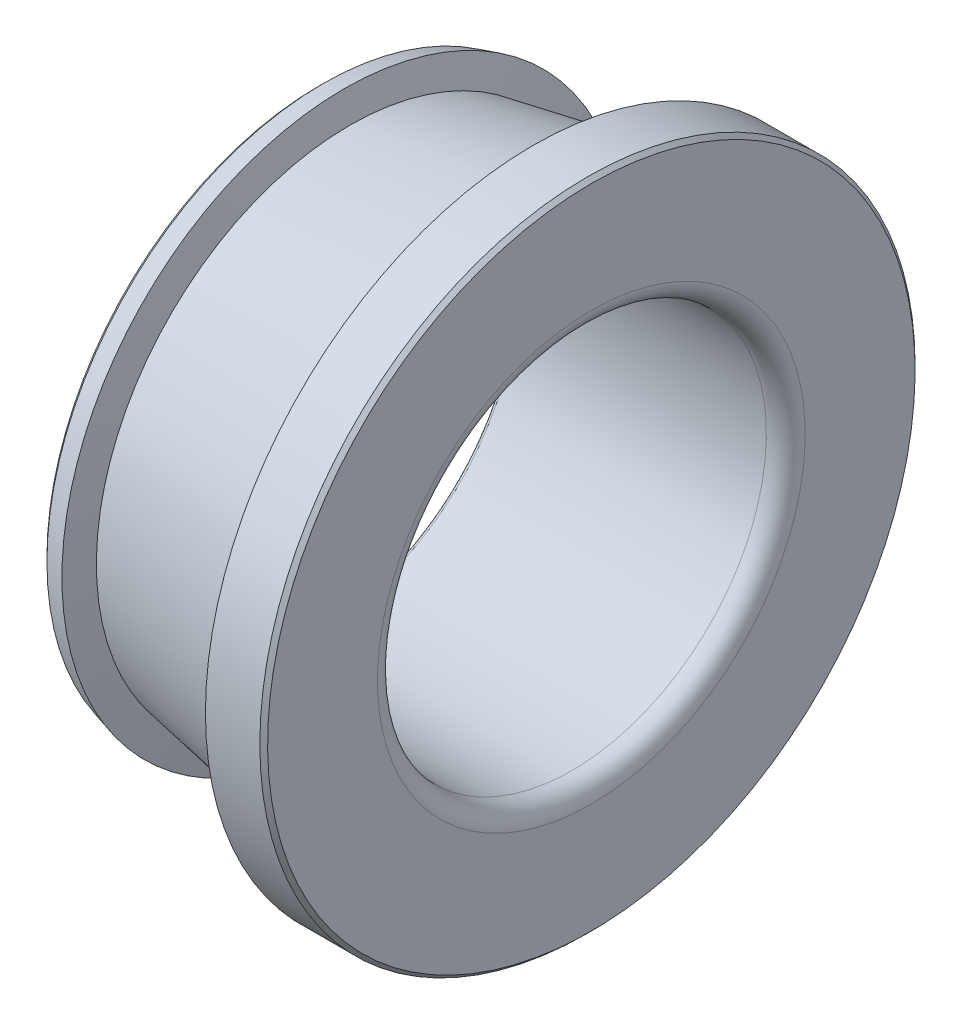
ISO-10303-21;
HEADER;
FILE_DESCRIPTION(('STEP AP214'),'2;1');
FILE_NAME('part.step','',(''),(''),'','','');
FILE_SCHEMA(('AUTOMOTIVE_DESIGN { 1 0 10303 214 1 1 1 1 }'));
ENDSEC;
DATA;
#1=APPLICATION_CONTEXT('core data for automotive mechanical design processes');
#2=APPLICATION_PROTOCOL_DEFINITION('international standard','automotive_design',2000,#1);
#3=PRODUCT_CONTEXT('',#1,'mechanical');
#4=PRODUCT('Part','Part','',(#3));
#5=PRODUCT_RELATED_PRODUCT_CATEGORY('part','',(#4));
#6=PRODUCT_DEFINITION_FORMATION('','',#4);
#7=PRODUCT_DEFINITION_CONTEXT('part definition',#1,'design');
#8=PRODUCT_DEFINITION('design','',#6,#7);
#9=PRODUCT_DEFINITION_SHAPE('','',#8);
#10=(LENGTH_UNIT() NAMED_UNIT(*) SI_UNIT(.MILLI.,.METRE.));
#11=(NAMED_UNIT(*) PLANE_ANGLE_UNIT() SI_UNIT($,.RADIAN.));
#12=(NAMED_UNIT(*) SI_UNIT($,.STERADIAN.) SOLID_ANGLE_UNIT());
#13=UNCERTAINTY_MEASURE_WITH_UNIT(LENGTH_MEASURE(1.E-05),#10,'distance_accuracy_value','');
#14=(GEOMETRIC_REPRESENTATION_CONTEXT(3) GLOBAL_UNCERTAINTY_ASSIGNED_CONTEXT((#13)) GLOBAL_UNIT_ASSIGNED_CONTEXT((#10,
#11,#12)) REPRESENTATION_CONTEXT('',''));
#15=CARTESIAN_POINT('',(0.,0.,0.));
#16=DIRECTION('',(0.,0.,1.));
#17=DIRECTION('',(1.,0.,0.));
#18=AXIS2_PLACEMENT_3D('',#15,#16,#17);
#19=CARTESIAN_POINT('',(6.125,0.,0.));
#20=DIRECTION('',(1.,0.,0.));
#21=DIRECTION('',(0.,1.,0.));
#22=AXIS2_PLACEMENT_3D('',#19,#20,#21);
#23=CONICAL_SURFACE('',#22,15.525,0.276179520839025);
#24=CARTESIAN_POINT('',(1.45,0.,0.));
#25=DIRECTION('',(1.,0.,0.));
#26=DIRECTION('',(0.,1.,0.));
#27=AXIS2_PLACEMENT_3D('',#24,#25,#26);
#28=CIRCLE('',#27,14.2);
#29=CARTESIAN_POINT('',(1.45,14.2,0.));
#30=VERTEX_POINT('',#29);
#31=EDGE_CURVE('E11',#30,#30,#28,.T.);
#32=ORIENTED_EDGE('',*,*,#31,.T.);
#33=EDGE_LOOP('',(#32));
#34=FACE_BOUND('',#33,.T.);
#35=CARTESIAN_POINT('',(2.52551392629312,0.,0.));
#36=DIRECTION('',(-1.,0.,0.));
#37=DIRECTION('',(0.,1.,0.));
#38=AXIS2_PLACEMENT_3D('',#35,#36,#37);
#39=CIRCLE('',#38,14.5048248026392);
#40=CARTESIAN_POINT('',(2.52551392629312,-14.5048248026392,0.));
#41=VERTEX_POINT('',#40);
#42=EDGE_CURVE('E64',#41,#41,#39,.T.);
#43=ORIENTED_EDGE('',*,*,#42,.T.);
#44=EDGE_LOOP('',(#43));
#45=FACE_BOUND('',#44,.T.);
#46=ADVANCED_FACE('F16',(#34,#45),#23,.T.);
#47=CARTESIAN_POINT('',(1.35,0.,0.));
#48=DIRECTION('',(1.,0.,0.));
#49=DIRECTION('',(0.,1.,0.));
#50=AXIS2_PLACEMENT_3D('',#47,#48,#49);
#51=CONICAL_SURFACE('',#50,14.1,0.785398163397446);
#52=CARTESIAN_POINT('',(1.25,0.,0.));
#53=DIRECTION('',(1.,0.,0.));
#54=DIRECTION('',(0.,1.,0.));
#55=AXIS2_PLACEMENT_3D('',#52,#53,#54);
#56=CIRCLE('',#55,14.);
#57=CARTESIAN_POINT('',(1.25,14.,0.));
#58=VERTEX_POINT('',#57);
#59=EDGE_CURVE('E19',#58,#58,#56,.T.);
#60=ORIENTED_EDGE('',*,*,#59,.T.);
#61=EDGE_LOOP('',(#60));
#62=FACE_BOUND('',#61,.T.);
#63=ORIENTED_EDGE('',*,*,#31,.F.);
#64=EDGE_LOOP('',(#63));
#65=FACE_BOUND('',#64,.T.);
#66=ADVANCED_FACE('F107',(#62,#65),#51,.T.);
#67=CARTESIAN_POINT('',(1.25,12.1,0.));
#68=DIRECTION('',(-1.,0.,0.));
#69=DIRECTION('',(0.,-1.,0.));
#70=AXIS2_PLACEMENT_3D('',#67,#68,#69);
#71=PLANE('',#70);
#72=CARTESIAN_POINT('',(1.25,0.,0.));
#73=DIRECTION('',(1.,0.,0.));
#74=DIRECTION('',(0.,1.,0.));
#75=AXIS2_PLACEMENT_3D('',#72,#73,#74);
#76=CIRCLE('',#75,10.2);
#77=CARTESIAN_POINT('',(1.25,10.2,0.));
#78=VERTEX_POINT('',#77);
#79=EDGE_CURVE('E48',#78,#78,#76,.T.);
#80=ORIENTED_EDGE('',*,*,#79,.T.);
#81=EDGE_LOOP('',(#80));
#82=FACE_BOUND('',#81,.T.);
#83=ORIENTED_EDGE('',*,*,#59,.F.);
#84=EDGE_LOOP('',(#83));
#85=FACE_BOUND('',#84,.T.);
#86=ADVANCED_FACE('F111',(#82,#85),#71,.T.);
#87=CARTESIAN_POINT('',(1.45,0.,0.));
#88=DIRECTION('',(1.,0.,0.));
#89=DIRECTION('',(0.,0.,-1.));
#90=AXIS2_PLACEMENT_3D('',#87,#88,#89);
#91=TOROIDAL_SURFACE('',#90,10.2,0.2);
#92=CARTESIAN_POINT('',(1.45,0.,0.));
#93=DIRECTION('',(1.,0.,0.));
#94=DIRECTION('',(0.,1.,0.));
#95=AXIS2_PLACEMENT_3D('',#92,#93,#94);
#96=CIRCLE('',#95,10.);
#97=CARTESIAN_POINT('',(1.45,10.,0.));
#98=VERTEX_POINT('',#97);
#99=EDGE_CURVE('E53',#98,#98,#96,.T.);
#100=ORIENTED_EDGE('',*,*,#99,.T.);
#101=EDGE_LOOP('',(#100));
#102=FACE_BOUND('',#101,.T.);
#103=ORIENTED_EDGE('',*,*,#79,.F.);
#104=EDGE_LOOP('',(#103));
#105=FACE_BOUND('',#104,.T.);
#106=ADVANCED_FACE('F116',(#102,#105),#91,.T.);
#107=CARTESIAN_POINT('',(7.85,0.,0.));
#108=DIRECTION('',(-1.,0.,0.));
#109=DIRECTION('',(0.,1.,0.));
#110=AXIS2_PLACEMENT_3D('',#107,#108,#109);
#111=CYLINDRICAL_SURFACE('',#110,10.);
#112=CARTESIAN_POINT('',(14.25,0.,0.));
#113=DIRECTION('',(1.,0.,0.));
#114=DIRECTION('',(0.,1.,0.));
#115=AXIS2_PLACEMENT_3D('',#112,#113,#114);
#116=CIRCLE('',#115,10.);
#117=CARTESIAN_POINT('',(14.25,10.,0.));
#118=VERTEX_POINT('',#117);
#119=EDGE_CURVE('E81',#118,#118,#116,.T.);
#120=ORIENTED_EDGE('',*,*,#119,.T.);
#121=EDGE_LOOP('',(#120));
#122=FACE_BOUND('',#121,.T.);
#123=ORIENTED_EDGE('',*,*,#99,.F.);
#124=EDGE_LOOP('',(#123));
#125=FACE_BOUND('',#124,.T.);
#126=ADVANCED_FACE('F122',(#122,#125),#111,.F.);
#127=CARTESIAN_POINT('',(14.25,0.,0.));
#128=DIRECTION('',(1.,0.,0.));
#129=DIRECTION('',(0.,0.,-1.));
#130=AXIS2_PLACEMENT_3D('',#127,#128,#129);
#131=TOROIDAL_SURFACE('',#130,11.,1.);
#132=CARTESIAN_POINT('',(15.25,0.,0.));
#133=DIRECTION('',(1.,0.,0.));
#134=DIRECTION('',(0.,1.,0.));
#135=AXIS2_PLACEMENT_3D('',#132,#133,#134);
#136=CIRCLE('',#135,11.);
#137=CARTESIAN_POINT('',(15.25,11.,0.));
#138=VERTEX_POINT('',#137);
#139=EDGE_CURVE('E79',#138,#138,#136,.T.);
#140=ORIENTED_EDGE('',*,*,#139,.T.);
#141=EDGE_LOOP('',(#140));
#142=FACE_BOUND('',#141,.T.);
#143=ORIENTED_EDGE('',*,*,#119,.F.);
#144=EDGE_LOOP('',(#143));
#145=FACE_BOUND('',#144,.T.);
#146=ADVANCED_FACE('F125',(#142,#145),#131,.T.);
#147=CARTESIAN_POINT('',(15.25,13.825,0.));
#148=DIRECTION('',(1.,0.,0.));
#149=DIRECTION('',(0.,1.,0.));
#150=AXIS2_PLACEMENT_3D('',#147,#148,#149);
#151=PLANE('',#150);
#152=CARTESIAN_POINT('',(15.25,0.,0.));
#153=DIRECTION('',(1.,0.,0.));
#154=DIRECTION('',(0.,1.,0.));
#155=AXIS2_PLACEMENT_3D('',#152,#153,#154);
#156=CIRCLE('',#155,16.65);
#157=CARTESIAN_POINT('',(15.25,16.65,0.));
#158=VERTEX_POINT('',#157);
#159=EDGE_CURVE('E73',#158,#158,#156,.T.);
#160=ORIENTED_EDGE('',*,*,#159,.T.);
#161=EDGE_LOOP('',(#160));
#162=FACE_BOUND('',#161,.T.);
#163=ORIENTED_EDGE('',*,*,#139,.F.);
#164=EDGE_LOOP('',(#163));
#165=FACE_BOUND('',#164,.T.);
#166=ADVANCED_FACE('F129',(#162,#165),#151,.T.);
#167=CARTESIAN_POINT('',(15.15,0.,0.));
#168=DIRECTION('',(-1.,0.,0.));
#169=DIRECTION('',(0.,1.,0.));
#170=AXIS2_PLACEMENT_3D('',#167,#168,#169);
#171=CONICAL_SURFACE('',#170,16.75,0.785398163397448);
#172=CARTESIAN_POINT('',(15.05,0.,0.));
#173=DIRECTION('',(1.,0.,0.));
#174=DIRECTION('',(0.,1.,0.));
#175=AXIS2_PLACEMENT_3D('',#172,#173,#174);
#176=CIRCLE('',#175,16.85);
#177=CARTESIAN_POINT('',(15.05,16.85,0.));
#178=VERTEX_POINT('',#177);
#179=EDGE_CURVE('E71',#178,#178,#176,.T.);
#180=ORIENTED_EDGE('',*,*,#179,.T.);
#181=EDGE_LOOP('',(#180));
#182=FACE_BOUND('',#181,.T.);
#183=ORIENTED_EDGE('',*,*,#159,.F.);
#184=EDGE_LOOP('',(#183));
#185=FACE_BOUND('',#184,.T.);
#186=ADVANCED_FACE('F133',(#182,#185),#171,.T.);
#187=CARTESIAN_POINT('',(12.925,0.,0.));
#188=DIRECTION('',(-1.,0.,0.));
#189=DIRECTION('',(0.,1.,0.));
#190=AXIS2_PLACEMENT_3D('',#187,#188,#189);
#191=CYLINDRICAL_SURFACE('',#190,16.85);
#192=ORIENTED_EDGE('',*,*,#179,.F.);
#193=EDGE_LOOP('',(#192));
#194=FACE_BOUND('',#193,.T.);
#195=CARTESIAN_POINT('',(12.252278944546,0.,0.));
#196=DIRECTION('',(1.,0.,0.));
#197=DIRECTION('',(0.,1.,0.));
#198=AXIS2_PLACEMENT_3D('',#195,#196,#197);
#199=CIRCLE('',#198,16.85);
#200=CARTESIAN_POINT('',(12.252278944546,-16.85,0.));
#201=VERTEX_POINT('',#200);
#202=EDGE_CURVE('E68',#201,#201,#199,.T.);
#203=ORIENTED_EDGE('',*,*,#202,.T.);
#204=EDGE_LOOP('',(#203));
#205=FACE_BOUND('',#204,.T.);
#206=ADVANCED_FACE('F69',(#194,#205),#191,.T.);
#207=CARTESIAN_POINT('',(11.9962723670912,0.,0.));
#208=DIRECTION('',(-1.,0.,0.));
#209=DIRECTION('',(0.,1.,0.));
#210=AXIS2_PLACEMENT_3D('',#207,#208,#209);
#211=CONICAL_SURFACE('',#210,18.0908215257425,1.36733107858515);
#212=CARTESIAN_POINT('',(12.6681361817099,0.,0.));
#213=DIRECTION('',(1.,0.,0.));
#214=DIRECTION('',(0.,1.,0.));
#215=AXIS2_PLACEMENT_3D('',#212,#213,#214);
#216=CIRCLE('',#215,14.8344087732484);
#217=CARTESIAN_POINT('',(12.6681361817099,14.8344087732484,0.));
#218=VERTEX_POINT('',#217);
#219=EDGE_CURVE('E75',#218,#218,#216,.T.);
#220=ORIENTED_EDGE('',*,*,#219,.T.);
#221=EDGE_LOOP('',(#220));
#222=FACE_BOUND('',#221,.T.);
#223=ORIENTED_EDGE('',*,*,#202,.F.);
#224=EDGE_LOOP('',(#223));
#225=FACE_BOUND('',#224,.T.);
#226=ADVANCED_FACE('F96',(#222,#225),#211,.F.);
#227=CARTESIAN_POINT('',(2.20254980319926,0.,0.));
#228=DIRECTION('',(-1.,0.,0.));
#229=DIRECTION('',(0.,1.,0.));
#230=AXIS2_PLACEMENT_3D('',#227,#228,#229);
#231=CONICAL_SURFACE('',#230,16.0701784742575,1.36733107858515);
#232=CARTESIAN_POINT('',(2.82872465163882,0.,0.));
#233=DIRECTION('',(1.,0.,0.));
#234=DIRECTION('',(0.,1.,0.));
#235=AXIS2_PLACEMENT_3D('',#232,#233,#234);
#236=CIRCLE('',#235,13.035212581792);
#237=CARTESIAN_POINT('',(2.82872465163882,13.035212581792,0.));
#238=VERTEX_POINT('',#237);
#239=EDGE_CURVE('E84',#238,#238,#236,.T.);
#240=ORIENTED_EDGE('',*,*,#239,.F.);
#241=EDGE_LOOP('',(#240));
#242=FACE_BOUND('',#241,.T.);
#243=ORIENTED_EDGE('',*,*,#42,.F.);
#244=EDGE_LOOP('',(#243));
#245=FACE_BOUND('',#244,.T.);
#246=ADVANCED_FACE('F93',(#242,#245),#231,.T.);
#247=CARTESIAN_POINT('',(7.74843041667437,0.,0.));
#248=DIRECTION('',(1.,0.,0.));
#249=DIRECTION('',(0.,1.,0.));
#250=AXIS2_PLACEMENT_3D('',#247,#248,#249);
#251=CONICAL_SURFACE('',#250,13.9348106775202,0.180857998408661);
#252=ORIENTED_EDGE('',*,*,#219,.F.);
#253=EDGE_LOOP('',(#252));
#254=FACE_BOUND('',#253,.T.);
#255=ORIENTED_EDGE('',*,*,#239,.T.);
#256=EDGE_LOOP('',(#255));
#257=FACE_BOUND('',#256,.T.);
#258=ADVANCED_FACE('F91',(#254,#257),#251,.T.);
#259=CLOSED_SHELL('',(#46,#66,#86,#106,#126,#146,#166,#186,#206,#226,#246,#258));
#260=MANIFOLD_SOLID_BREP('B1',#259);
#261=ADVANCED_BREP_SHAPE_REPRESENTATION('',(#18,#260),#14);
#262=SHAPE_DEFINITION_REPRESENTATION(#9,#261);
ENDSEC;
END-ISO-10303-21;
